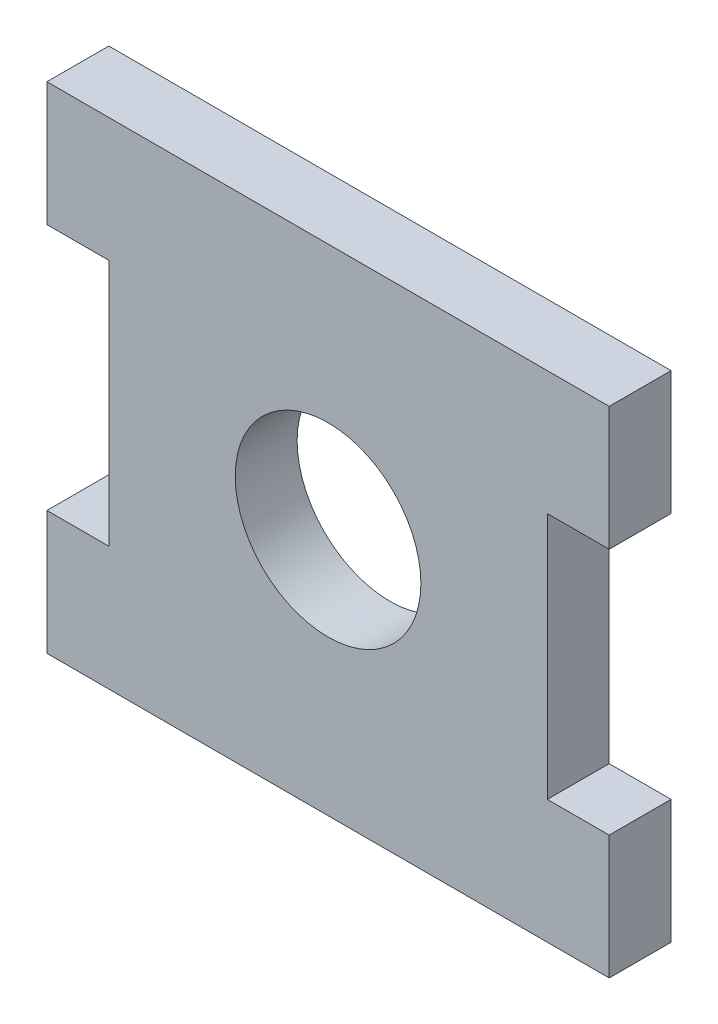
ISO-10303-21;
HEADER;
FILE_DESCRIPTION(('STEP AP214'),'2;1');
FILE_NAME('part.step','',(''),(''),'','','');
FILE_SCHEMA(('AUTOMOTIVE_DESIGN { 1 0 10303 214 1 1 1 1 }'));
ENDSEC;
DATA;
#1=APPLICATION_CONTEXT('core data for automotive mechanical design processes');
#2=APPLICATION_PROTOCOL_DEFINITION('international standard','automotive_design',2000,#1);
#3=PRODUCT_CONTEXT('',#1,'mechanical');
#4=PRODUCT('Part','Part','',(#3));
#5=PRODUCT_RELATED_PRODUCT_CATEGORY('part','',(#4));
#6=PRODUCT_DEFINITION_FORMATION('','',#4);
#7=PRODUCT_DEFINITION_CONTEXT('part definition',#1,'design');
#8=PRODUCT_DEFINITION('design','',#6,#7);
#9=PRODUCT_DEFINITION_SHAPE('','',#8);
#10=(LENGTH_UNIT() NAMED_UNIT(*) SI_UNIT(.MILLI.,.METRE.));
#11=(NAMED_UNIT(*) PLANE_ANGLE_UNIT() SI_UNIT($,.RADIAN.));
#12=(NAMED_UNIT(*) SI_UNIT($,.STERADIAN.) SOLID_ANGLE_UNIT());
#13=UNCERTAINTY_MEASURE_WITH_UNIT(LENGTH_MEASURE(1.E-05),#10,'distance_accuracy_value','');
#14=(GEOMETRIC_REPRESENTATION_CONTEXT(3) GLOBAL_UNCERTAINTY_ASSIGNED_CONTEXT((#13)) GLOBAL_UNIT_ASSIGNED_CONTEXT((#10,
#11,#12)) REPRESENTATION_CONTEXT('',''));
#15=CARTESIAN_POINT('',(0.,0.,0.));
#16=DIRECTION('',(0.,0.,1.));
#17=DIRECTION('',(1.,0.,0.));
#18=AXIS2_PLACEMENT_3D('',#15,#16,#17);
#19=CARTESIAN_POINT('',(0.,50.8,6.35));
#20=DIRECTION('',(0.,-1.,0.));
#21=DIRECTION('',(0.,0.,-1.));
#22=AXIS2_PLACEMENT_3D('',#19,#20,#21);
#23=PLANE('',#22);
#24=DIRECTION('',(-1.,0.,0.));
#25=VECTOR('',#24,1.);
#26=CARTESIAN_POINT('',(0.,50.8,0.));
#27=LINE('',#26,#25);
#28=CARTESIAN_POINT('',(57.7,50.8,0.));
#29=VERTEX_POINT('',#28);
#30=CARTESIAN_POINT('',(0.,50.8,0.));
#31=VERTEX_POINT('',#30);
#32=EDGE_CURVE('E177',#29,#31,#27,.T.);
#33=ORIENTED_EDGE('',*,*,#32,.T.);
#34=DIRECTION('',(0.,0.,-1.));
#35=VECTOR('',#34,1.);
#36=CARTESIAN_POINT('',(0.,50.8,6.35));
#37=LINE('',#36,#35);
#38=CARTESIAN_POINT('',(0.,50.8,6.35));
#39=VERTEX_POINT('',#38);
#40=EDGE_CURVE('E11',#39,#31,#37,.T.);
#41=ORIENTED_EDGE('',*,*,#40,.F.);
#42=DIRECTION('',(-1.,0.,0.));
#43=VECTOR('',#42,1.);
#44=CARTESIAN_POINT('',(0.,50.8,6.35));
#45=LINE('',#44,#43);
#46=CARTESIAN_POINT('',(57.7,50.8,6.35));
#47=VERTEX_POINT('',#46);
#48=EDGE_CURVE('E220',#47,#39,#45,.T.);
#49=ORIENTED_EDGE('',*,*,#48,.F.);
#50=DIRECTION('',(0.,0.,-1.));
#51=VECTOR('',#50,1.);
#52=CARTESIAN_POINT('',(57.7,50.8,6.35));
#53=LINE('',#52,#51);
#54=EDGE_CURVE('E38',#47,#29,#53,.T.);
#55=ORIENTED_EDGE('',*,*,#54,.T.);
#56=EDGE_LOOP('',(#33,#41,#49,#55));
#57=FACE_BOUND('',#56,.T.);
#58=ADVANCED_FACE('F16',(#57),#23,.F.);
#59=CARTESIAN_POINT('',(0.,0.,6.35));
#60=DIRECTION('',(1.,0.,0.));
#61=DIRECTION('',(0.,1.,0.));
#62=AXIS2_PLACEMENT_3D('',#59,#60,#61);
#63=PLANE('',#62);
#64=DIRECTION('',(0.,-1.,0.));
#65=VECTOR('',#64,1.);
#66=CARTESIAN_POINT('',(0.,0.,0.));
#67=LINE('',#66,#65);
#68=CARTESIAN_POINT('',(0.,38.1,0.));
#69=VERTEX_POINT('',#68);
#70=EDGE_CURVE('E180',#31,#69,#67,.T.);
#71=ORIENTED_EDGE('',*,*,#70,.T.);
#72=DIRECTION('',(0.,0.,-1.));
#73=VECTOR('',#72,1.);
#74=CARTESIAN_POINT('',(0.,38.1,6.35));
#75=LINE('',#74,#73);
#76=CARTESIAN_POINT('',(0.,38.1,6.35));
#77=VERTEX_POINT('',#76);
#78=EDGE_CURVE('E25',#77,#69,#75,.T.);
#79=ORIENTED_EDGE('',*,*,#78,.F.);
#80=DIRECTION('',(0.,-1.,0.));
#81=VECTOR('',#80,1.);
#82=CARTESIAN_POINT('',(0.,0.,6.35));
#83=LINE('',#82,#81);
#84=EDGE_CURVE('E106',#39,#77,#83,.T.);
#85=ORIENTED_EDGE('',*,*,#84,.F.);
#86=ORIENTED_EDGE('',*,*,#40,.T.);
#87=EDGE_LOOP('',(#71,#79,#85,#86));
#88=FACE_BOUND('',#87,.T.);
#89=ADVANCED_FACE('F253',(#88),#63,.F.);
#90=CARTESIAN_POINT('',(0.,38.1,6.35));
#91=DIRECTION('',(0.,-1.,0.));
#92=DIRECTION('',(0.,0.,-1.));
#93=AXIS2_PLACEMENT_3D('',#90,#91,#92);
#94=PLANE('',#93);
#95=DIRECTION('',(-1.,0.,0.));
#96=VECTOR('',#95,1.);
#97=CARTESIAN_POINT('',(0.,38.1,0.));
#98=LINE('',#97,#96);
#99=CARTESIAN_POINT('',(6.35,38.1,0.));
#100=VERTEX_POINT('',#99);
#101=EDGE_CURVE('E185',#100,#69,#98,.T.);
#102=ORIENTED_EDGE('',*,*,#101,.F.);
#103=DIRECTION('',(0.,0.,-1.));
#104=VECTOR('',#103,1.);
#105=CARTESIAN_POINT('',(6.35,38.1,6.35));
#106=LINE('',#105,#104);
#107=CARTESIAN_POINT('',(6.35,38.1,6.35));
#108=VERTEX_POINT('',#107);
#109=EDGE_CURVE('E243',#108,#100,#106,.T.);
#110=ORIENTED_EDGE('',*,*,#109,.F.);
#111=DIRECTION('',(-1.,0.,0.));
#112=VECTOR('',#111,1.);
#113=CARTESIAN_POINT('',(0.,38.1,6.35));
#114=LINE('',#113,#112);
#115=EDGE_CURVE('E252',#108,#77,#114,.T.);
#116=ORIENTED_EDGE('',*,*,#115,.T.);
#117=ORIENTED_EDGE('',*,*,#78,.T.);
#118=EDGE_LOOP('',(#102,#110,#116,#117));
#119=FACE_BOUND('',#118,.T.);
#120=ADVANCED_FACE('F250',(#119),#94,.T.);
#121=CARTESIAN_POINT('',(6.35000000000002,0.,6.35));
#122=DIRECTION('',(-1.,0.,0.));
#123=DIRECTION('',(0.,-1.,0.));
#124=AXIS2_PLACEMENT_3D('',#121,#122,#123);
#125=PLANE('',#124);
#126=DIRECTION('',(0.,1.,0.));
#127=VECTOR('',#126,1.);
#128=CARTESIAN_POINT('',(6.35000000000002,0.,0.));
#129=LINE('',#128,#127);
#130=CARTESIAN_POINT('',(6.35000000000002,12.7,0.));
#131=VERTEX_POINT('',#130);
#132=EDGE_CURVE('E189',#131,#100,#129,.T.);
#133=ORIENTED_EDGE('',*,*,#132,.F.);
#134=DIRECTION('',(0.,0.,-1.));
#135=VECTOR('',#134,1.);
#136=CARTESIAN_POINT('',(6.35000000000002,12.7,6.35));
#137=LINE('',#136,#135);
#138=CARTESIAN_POINT('',(6.35000000000002,12.7,6.35));
#139=VERTEX_POINT('',#138);
#140=EDGE_CURVE('E240',#139,#131,#137,.T.);
#141=ORIENTED_EDGE('',*,*,#140,.F.);
#142=DIRECTION('',(0.,1.,0.));
#143=VECTOR('',#142,1.);
#144=CARTESIAN_POINT('',(6.35000000000002,0.,6.35));
#145=LINE('',#144,#143);
#146=EDGE_CURVE('E263',#139,#108,#145,.T.);
#147=ORIENTED_EDGE('',*,*,#146,.T.);
#148=ORIENTED_EDGE('',*,*,#109,.T.);
#149=EDGE_LOOP('',(#133,#141,#147,#148));
#150=FACE_BOUND('',#149,.T.);
#151=ADVANCED_FACE('F260',(#150),#125,.T.);
#152=CARTESIAN_POINT('',(0.,12.7,6.35));
#153=DIRECTION('',(0.,1.,0.));
#154=DIRECTION('',(-1.,0.,0.));
#155=AXIS2_PLACEMENT_3D('',#152,#153,#154);
#156=PLANE('',#155);
#157=DIRECTION('',(1.,0.,0.));
#158=VECTOR('',#157,1.);
#159=CARTESIAN_POINT('',(0.,12.7,0.));
#160=LINE('',#159,#158);
#161=CARTESIAN_POINT('',(0.,12.7,0.));
#162=VERTEX_POINT('',#161);
#163=EDGE_CURVE('E193',#162,#131,#160,.T.);
#164=ORIENTED_EDGE('',*,*,#163,.F.);
#165=DIRECTION('',(0.,0.,-1.));
#166=VECTOR('',#165,1.);
#167=CARTESIAN_POINT('',(0.,12.7,6.35));
#168=LINE('',#167,#166);
#169=CARTESIAN_POINT('',(0.,12.7,6.35));
#170=VERTEX_POINT('',#169);
#171=EDGE_CURVE('E237',#170,#162,#168,.T.);
#172=ORIENTED_EDGE('',*,*,#171,.F.);
#173=DIRECTION('',(1.,0.,0.));
#174=VECTOR('',#173,1.);
#175=CARTESIAN_POINT('',(0.,12.7,6.35));
#176=LINE('',#175,#174);
#177=EDGE_CURVE('E272',#170,#139,#176,.T.);
#178=ORIENTED_EDGE('',*,*,#177,.T.);
#179=ORIENTED_EDGE('',*,*,#140,.T.);
#180=EDGE_LOOP('',(#164,#172,#178,#179));
#181=FACE_BOUND('',#180,.T.);
#182=ADVANCED_FACE('F365',(#181),#156,.T.);
#183=CARTESIAN_POINT('',(0.,0.,6.35));
#184=DIRECTION('',(-1.,0.,0.));
#185=DIRECTION('',(0.,0.,1.));
#186=AXIS2_PLACEMENT_3D('',#183,#184,#185);
#187=PLANE('',#186);
#188=DIRECTION('',(0.,1.,0.));
#189=VECTOR('',#188,1.);
#190=CARTESIAN_POINT('',(0.,0.,0.));
#191=LINE('',#190,#189);
#192=CARTESIAN_POINT('',(0.,0.,0.));
#193=VERTEX_POINT('',#192);
#194=EDGE_CURVE('E197',#193,#162,#191,.T.);
#195=ORIENTED_EDGE('',*,*,#194,.F.);
#196=DIRECTION('',(0.,0.,-1.));
#197=VECTOR('',#196,1.);
#198=CARTESIAN_POINT('',(0.,0.,6.35));
#199=LINE('',#198,#197);
#200=CARTESIAN_POINT('',(0.,0.,6.35));
#201=VERTEX_POINT('',#200);
#202=EDGE_CURVE('E234',#201,#193,#199,.T.);
#203=ORIENTED_EDGE('',*,*,#202,.F.);
#204=DIRECTION('',(0.,1.,0.));
#205=VECTOR('',#204,1.);
#206=CARTESIAN_POINT('',(0.,0.,6.35));
#207=LINE('',#206,#205);
#208=EDGE_CURVE('E280',#201,#170,#207,.T.);
#209=ORIENTED_EDGE('',*,*,#208,.T.);
#210=ORIENTED_EDGE('',*,*,#171,.T.);
#211=EDGE_LOOP('',(#195,#203,#209,#210));
#212=FACE_BOUND('',#211,.T.);
#213=ADVANCED_FACE('F466',(#212),#187,.T.);
#214=CARTESIAN_POINT('',(0.,0.,6.35));
#215=DIRECTION('',(0.,1.,0.));
#216=DIRECTION('',(0.,0.,1.));
#217=AXIS2_PLACEMENT_3D('',#214,#215,#216);
#218=PLANE('',#217);
#219=DIRECTION('',(1.,0.,0.));
#220=VECTOR('',#219,1.);
#221=CARTESIAN_POINT('',(0.,0.,0.));
#222=LINE('',#221,#220);
#223=CARTESIAN_POINT('',(57.7,0.,0.));
#224=VERTEX_POINT('',#223);
#225=EDGE_CURVE('E200',#193,#224,#222,.T.);
#226=ORIENTED_EDGE('',*,*,#225,.T.);
#227=DIRECTION('',(0.,0.,-1.));
#228=VECTOR('',#227,1.);
#229=CARTESIAN_POINT('',(57.7,0.,6.35));
#230=LINE('',#229,#228);
#231=CARTESIAN_POINT('',(57.7,0.,6.35));
#232=VERTEX_POINT('',#231);
#233=EDGE_CURVE('E230',#232,#224,#230,.T.);
#234=ORIENTED_EDGE('',*,*,#233,.F.);
#235=DIRECTION('',(1.,0.,0.));
#236=VECTOR('',#235,1.);
#237=CARTESIAN_POINT('',(0.,0.,6.35));
#238=LINE('',#237,#236);
#239=EDGE_CURVE('E284',#201,#232,#238,.T.);
#240=ORIENTED_EDGE('',*,*,#239,.F.);
#241=ORIENTED_EDGE('',*,*,#202,.T.);
#242=EDGE_LOOP('',(#226,#234,#240,#241));
#243=FACE_BOUND('',#242,.T.);
#244=ADVANCED_FACE('F437',(#243),#218,.F.);
#245=CARTESIAN_POINT('',(57.7,0.,6.35));
#246=DIRECTION('',(-1.,0.,0.));
#247=DIRECTION('',(0.,0.,1.));
#248=AXIS2_PLACEMENT_3D('',#245,#246,#247);
#249=PLANE('',#248);
#250=DIRECTION('',(0.,1.,0.));
#251=VECTOR('',#250,1.);
#252=CARTESIAN_POINT('',(57.7,0.,0.));
#253=LINE('',#252,#251);
#254=CARTESIAN_POINT('',(57.7,12.7,0.));
#255=VERTEX_POINT('',#254);
#256=EDGE_CURVE('E203',#224,#255,#253,.T.);
#257=ORIENTED_EDGE('',*,*,#256,.T.);
#258=DIRECTION('',(0.,0.,-1.));
#259=VECTOR('',#258,1.);
#260=CARTESIAN_POINT('',(57.7,12.7,6.35));
#261=LINE('',#260,#259);
#262=CARTESIAN_POINT('',(57.7,12.7,6.35));
#263=VERTEX_POINT('',#262);
#264=EDGE_CURVE('E227',#263,#255,#261,.T.);
#265=ORIENTED_EDGE('',*,*,#264,.F.);
#266=DIRECTION('',(0.,1.,0.));
#267=VECTOR('',#266,1.);
#268=CARTESIAN_POINT('',(57.7,0.,6.35));
#269=LINE('',#268,#267);
#270=EDGE_CURVE('E287',#232,#263,#269,.T.);
#271=ORIENTED_EDGE('',*,*,#270,.F.);
#272=ORIENTED_EDGE('',*,*,#233,.T.);
#273=EDGE_LOOP('',(#257,#265,#271,#272));
#274=FACE_BOUND('',#273,.T.);
#275=ADVANCED_FACE('F414',(#274),#249,.F.);
#276=CARTESIAN_POINT('',(0.,12.7,6.35));
#277=DIRECTION('',(0.,1.,0.));
#278=DIRECTION('',(0.,0.,1.));
#279=AXIS2_PLACEMENT_3D('',#276,#277,#278);
#280=PLANE('',#279);
#281=DIRECTION('',(1.,0.,0.));
#282=VECTOR('',#281,1.);
#283=CARTESIAN_POINT('',(0.,12.7,0.));
#284=LINE('',#283,#282);
#285=CARTESIAN_POINT('',(51.35,12.7,0.));
#286=VERTEX_POINT('',#285);
#287=EDGE_CURVE('E207',#286,#255,#284,.T.);
#288=ORIENTED_EDGE('',*,*,#287,.F.);
#289=DIRECTION('',(0.,0.,-1.));
#290=VECTOR('',#289,1.);
#291=CARTESIAN_POINT('',(51.35,12.7,6.35));
#292=LINE('',#291,#290);
#293=CARTESIAN_POINT('',(51.35,12.7,6.35));
#294=VERTEX_POINT('',#293);
#295=EDGE_CURVE('E162',#294,#286,#292,.T.);
#296=ORIENTED_EDGE('',*,*,#295,.F.);
#297=DIRECTION('',(1.,0.,0.));
#298=VECTOR('',#297,1.);
#299=CARTESIAN_POINT('',(0.,12.7,6.35));
#300=LINE('',#299,#298);
#301=EDGE_CURVE('E150',#294,#263,#300,.T.);
#302=ORIENTED_EDGE('',*,*,#301,.T.);
#303=ORIENTED_EDGE('',*,*,#264,.T.);
#304=EDGE_LOOP('',(#288,#296,#302,#303));
#305=FACE_BOUND('',#304,.T.);
#306=ADVANCED_FACE('F295',(#305),#280,.T.);
#307=CARTESIAN_POINT('',(51.35,0.,6.35));
#308=DIRECTION('',(-1.,0.,0.));
#309=DIRECTION('',(0.,-1.,0.));
#310=AXIS2_PLACEMENT_3D('',#307,#308,#309);
#311=PLANE('',#310);
#312=DIRECTION('',(0.,1.,0.));
#313=VECTOR('',#312,1.);
#314=CARTESIAN_POINT('',(51.35,0.,0.));
#315=LINE('',#314,#313);
#316=CARTESIAN_POINT('',(51.35,38.1,0.));
#317=VERTEX_POINT('',#316);
#318=EDGE_CURVE('E158',#286,#317,#315,.T.);
#319=ORIENTED_EDGE('',*,*,#318,.T.);
#320=DIRECTION('',(0.,0.,-1.));
#321=VECTOR('',#320,1.);
#322=CARTESIAN_POINT('',(51.35,38.1,6.35));
#323=LINE('',#322,#321);
#324=CARTESIAN_POINT('',(51.35,38.1,6.35));
#325=VERTEX_POINT('',#324);
#326=EDGE_CURVE('E155',#325,#317,#323,.T.);
#327=ORIENTED_EDGE('',*,*,#326,.F.);
#328=DIRECTION('',(0.,1.,0.));
#329=VECTOR('',#328,1.);
#330=CARTESIAN_POINT('',(51.35,0.,6.35));
#331=LINE('',#330,#329);
#332=EDGE_CURVE('E143',#294,#325,#331,.T.);
#333=ORIENTED_EDGE('',*,*,#332,.F.);
#334=ORIENTED_EDGE('',*,*,#295,.T.);
#335=EDGE_LOOP('',(#319,#327,#333,#334));
#336=FACE_BOUND('',#335,.T.);
#337=ADVANCED_FACE('F156',(#336),#311,.F.);
#338=CARTESIAN_POINT('',(0.,38.1,6.35));
#339=DIRECTION('',(0.,1.,0.));
#340=DIRECTION('',(0.,0.,1.));
#341=AXIS2_PLACEMENT_3D('',#338,#339,#340);
#342=PLANE('',#341);
#343=DIRECTION('',(1.,0.,0.));
#344=VECTOR('',#343,1.);
#345=CARTESIAN_POINT('',(0.,38.1,0.));
#346=LINE('',#345,#344);
#347=CARTESIAN_POINT('',(57.7,38.1,0.));
#348=VERTEX_POINT('',#347);
#349=EDGE_CURVE('E213',#317,#348,#346,.T.);
#350=ORIENTED_EDGE('',*,*,#349,.T.);
#351=DIRECTION('',(0.,0.,-1.));
#352=VECTOR('',#351,1.);
#353=CARTESIAN_POINT('',(57.7,38.1,6.35));
#354=LINE('',#353,#352);
#355=CARTESIAN_POINT('',(57.7,38.1,6.35));
#356=VERTEX_POINT('',#355);
#357=EDGE_CURVE('E90',#356,#348,#354,.T.);
#358=ORIENTED_EDGE('',*,*,#357,.F.);
#359=DIRECTION('',(1.,0.,0.));
#360=VECTOR('',#359,1.);
#361=CARTESIAN_POINT('',(0.,38.1,6.35));
#362=LINE('',#361,#360);
#363=EDGE_CURVE('E148',#325,#356,#362,.T.);
#364=ORIENTED_EDGE('',*,*,#363,.F.);
#365=ORIENTED_EDGE('',*,*,#326,.T.);
#366=EDGE_LOOP('',(#350,#358,#364,#365));
#367=FACE_BOUND('',#366,.T.);
#368=ADVANCED_FACE('F164',(#367),#342,.F.);
#369=CARTESIAN_POINT('',(57.7000000000001,0.,6.35));
#370=DIRECTION('',(1.,0.,0.));
#371=DIRECTION('',(0.,1.,0.));
#372=AXIS2_PLACEMENT_3D('',#369,#370,#371);
#373=PLANE('',#372);
#374=DIRECTION('',(0.,-1.,0.));
#375=VECTOR('',#374,1.);
#376=CARTESIAN_POINT('',(57.7000000000001,0.,0.));
#377=LINE('',#376,#375);
#378=EDGE_CURVE('E216',#29,#348,#377,.T.);
#379=ORIENTED_EDGE('',*,*,#378,.F.);
#380=ORIENTED_EDGE('',*,*,#54,.F.);
#381=DIRECTION('',(0.,-1.,0.));
#382=VECTOR('',#381,1.);
#383=CARTESIAN_POINT('',(57.7000000000001,0.,6.35));
#384=LINE('',#383,#382);
#385=EDGE_CURVE('E166',#47,#356,#384,.T.);
#386=ORIENTED_EDGE('',*,*,#385,.T.);
#387=ORIENTED_EDGE('',*,*,#357,.T.);
#388=EDGE_LOOP('',(#379,#380,#386,#387));
#389=FACE_BOUND('',#388,.T.);
#390=ADVANCED_FACE('F298',(#389),#373,.T.);
#391=CARTESIAN_POINT('',(0.,0.,6.35));
#392=DIRECTION('',(0.,0.,1.));
#393=DIRECTION('',(1.,0.,0.));
#394=AXIS2_PLACEMENT_3D('',#391,#392,#393);
#395=PLANE('',#394);
#396=CARTESIAN_POINT('',(28.85,25.4,6.35));
#397=DIRECTION('',(0.,0.,1.));
#398=DIRECTION('',(1.,0.,0.));
#399=AXIS2_PLACEMENT_3D('',#396,#397,#398);
#400=CIRCLE('',#399,9.525);
#401=CARTESIAN_POINT('',(38.375,25.4,6.35));
#402=VERTEX_POINT('',#401);
#403=EDGE_CURVE('E181',#402,#402,#400,.T.);
#404=ORIENTED_EDGE('',*,*,#403,.F.);
#405=EDGE_LOOP('',(#404));
#406=FACE_BOUND('',#405,.T.);
#407=ORIENTED_EDGE('',*,*,#48,.T.);
#408=ORIENTED_EDGE('',*,*,#84,.T.);
#409=ORIENTED_EDGE('',*,*,#115,.F.);
#410=ORIENTED_EDGE('',*,*,#146,.F.);
#411=ORIENTED_EDGE('',*,*,#177,.F.);
#412=ORIENTED_EDGE('',*,*,#208,.F.);
#413=ORIENTED_EDGE('',*,*,#239,.T.);
#414=ORIENTED_EDGE('',*,*,#270,.T.);
#415=ORIENTED_EDGE('',*,*,#301,.F.);
#416=ORIENTED_EDGE('',*,*,#332,.T.);
#417=ORIENTED_EDGE('',*,*,#363,.T.);
#418=ORIENTED_EDGE('',*,*,#385,.F.);
#419=EDGE_LOOP('',(#407,#408,#409,#410,#411,#412,#413,#414,#415,#416,#417,#418));
#420=FACE_BOUND('',#419,.T.);
#421=ADVANCED_FACE('F145',(#406,#420),#395,.T.);
#422=CARTESIAN_POINT('',(0.,0.,0.));
#423=DIRECTION('',(0.,0.,1.));
#424=DIRECTION('',(1.,0.,0.));
#425=AXIS2_PLACEMENT_3D('',#422,#423,#424);
#426=PLANE('',#425);
#427=CARTESIAN_POINT('',(28.85,25.4,0.));
#428=DIRECTION('',(0.,0.,1.));
#429=DIRECTION('',(1.,0.,0.));
#430=AXIS2_PLACEMENT_3D('',#427,#428,#429);
#431=CIRCLE('',#430,9.525);
#432=CARTESIAN_POINT('',(38.375,25.4,0.));
#433=VERTEX_POINT('',#432);
#434=EDGE_CURVE('E321',#433,#433,#431,.T.);
#435=ORIENTED_EDGE('',*,*,#434,.T.);
#436=EDGE_LOOP('',(#435));
#437=FACE_BOUND('',#436,.T.);
#438=ORIENTED_EDGE('',*,*,#32,.F.);
#439=ORIENTED_EDGE('',*,*,#378,.T.);
#440=ORIENTED_EDGE('',*,*,#349,.F.);
#441=ORIENTED_EDGE('',*,*,#318,.F.);
#442=ORIENTED_EDGE('',*,*,#287,.T.);
#443=ORIENTED_EDGE('',*,*,#256,.F.);
#444=ORIENTED_EDGE('',*,*,#225,.F.);
#445=ORIENTED_EDGE('',*,*,#194,.T.);
#446=ORIENTED_EDGE('',*,*,#163,.T.);
#447=ORIENTED_EDGE('',*,*,#132,.T.);
#448=ORIENTED_EDGE('',*,*,#101,.T.);
#449=ORIENTED_EDGE('',*,*,#70,.F.);
#450=EDGE_LOOP('',(#438,#439,#440,#441,#442,#443,#444,#445,#446,#447,#448,#449));
#451=FACE_BOUND('',#450,.T.);
#452=ADVANCED_FACE('F256',(#437,#451),#426,.F.);
#453=CARTESIAN_POINT('',(28.85,25.4,0.));
#454=DIRECTION('',(0.,0.,1.));
#455=DIRECTION('',(1.,0.,0.));
#456=AXIS2_PLACEMENT_3D('',#453,#454,#455);
#457=CYLINDRICAL_SURFACE('',#456,9.525);
#458=ORIENTED_EDGE('',*,*,#434,.F.);
#459=EDGE_LOOP('',(#458));
#460=FACE_BOUND('',#459,.T.);
#461=ORIENTED_EDGE('',*,*,#403,.T.);
#462=EDGE_LOOP('',(#461));
#463=FACE_BOUND('',#462,.T.);
#464=ADVANCED_FACE('F330',(#460,#463),#457,.F.);
#465=CLOSED_SHELL('',(#58,#89,#120,#151,#182,#213,#244,#275,#306,#337,#368,#390,#421,#452,#464));
#466=MANIFOLD_SOLID_BREP('B1',#465);
#467=ADVANCED_BREP_SHAPE_REPRESENTATION('',(#18,#466),#14);
#468=SHAPE_DEFINITION_REPRESENTATION(#9,#467);
ENDSEC;
END-ISO-10303-21;
